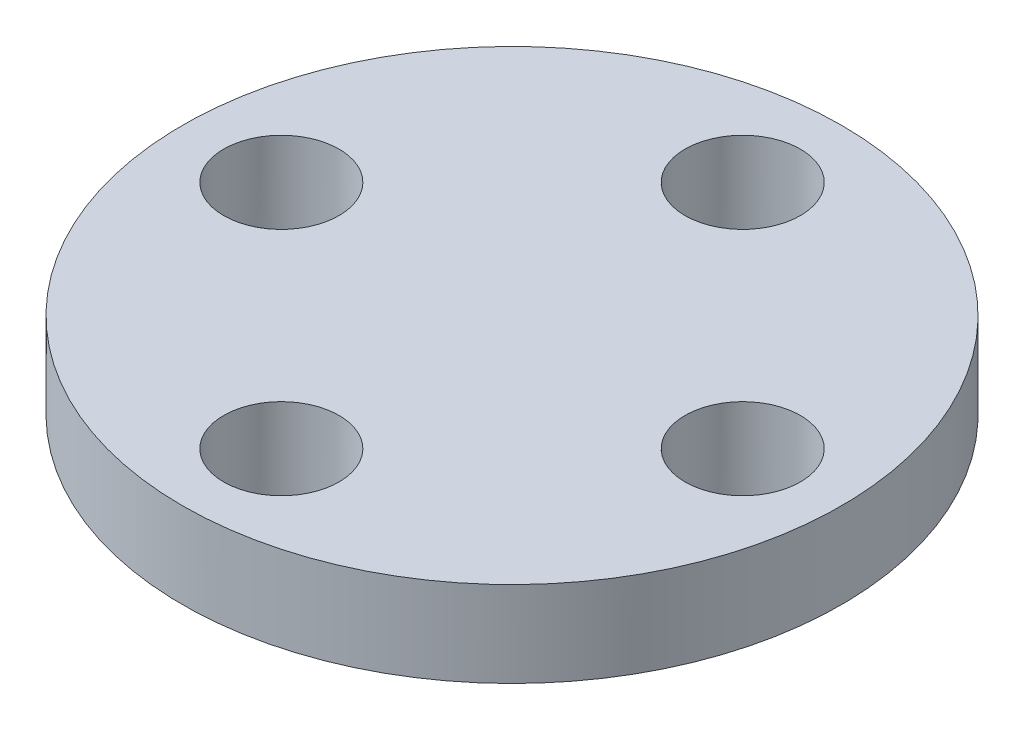
ISO-10303-21;
HEADER;
FILE_DESCRIPTION(('STEP AP214'),'2;1');
FILE_NAME('part.step','',(''),(''),'','','');
FILE_SCHEMA(('AUTOMOTIVE_DESIGN { 1 0 10303 214 1 1 1 1 }'));
ENDSEC;
DATA;
#1=APPLICATION_CONTEXT('core data for automotive mechanical design processes');
#2=APPLICATION_PROTOCOL_DEFINITION('international standard','automotive_design',2000,#1);
#3=PRODUCT_CONTEXT('',#1,'mechanical');
#4=PRODUCT('Part','Part','',(#3));
#5=PRODUCT_RELATED_PRODUCT_CATEGORY('part','',(#4));
#6=PRODUCT_DEFINITION_FORMATION('','',#4);
#7=PRODUCT_DEFINITION_CONTEXT('part definition',#1,'design');
#8=PRODUCT_DEFINITION('design','',#6,#7);
#9=PRODUCT_DEFINITION_SHAPE('','',#8);
#10=(LENGTH_UNIT() NAMED_UNIT(*) SI_UNIT(.MILLI.,.METRE.));
#11=(NAMED_UNIT(*) PLANE_ANGLE_UNIT() SI_UNIT($,.RADIAN.));
#12=(NAMED_UNIT(*) SI_UNIT($,.STERADIAN.) SOLID_ANGLE_UNIT());
#13=UNCERTAINTY_MEASURE_WITH_UNIT(LENGTH_MEASURE(1.E-05),#10,'distance_accuracy_value','');
#14=(GEOMETRIC_REPRESENTATION_CONTEXT(3) GLOBAL_UNCERTAINTY_ASSIGNED_CONTEXT((#13)) GLOBAL_UNIT_ASSIGNED_CONTEXT((#10,
#11,#12)) REPRESENTATION_CONTEXT('',''));
#15=CARTESIAN_POINT('',(0.,0.,0.));
#16=DIRECTION('',(0.,0.,1.));
#17=DIRECTION('',(1.,0.,0.));
#18=AXIS2_PLACEMENT_3D('',#15,#16,#17);
#19=CARTESIAN_POINT('',(0.,4.5,0.));
#20=DIRECTION('',(0.,-1.,0.));
#21=DIRECTION('',(0.,0.,-1.));
#22=AXIS2_PLACEMENT_3D('',#19,#20,#21);
#23=CYLINDRICAL_SURFACE('',#22,10.);
#24=CARTESIAN_POINT('',(0.,4.5,0.));
#25=DIRECTION('',(0.,1.,0.));
#26=DIRECTION('',(0.,0.,1.));
#27=AXIS2_PLACEMENT_3D('',#24,#25,#26);
#28=CIRCLE('',#27,10.);
#29=CARTESIAN_POINT('',(0.,4.5,10.));
#30=VERTEX_POINT('',#29);
#31=EDGE_CURVE('E11',#30,#30,#28,.T.);
#32=ORIENTED_EDGE('',*,*,#31,.F.);
#33=EDGE_LOOP('',(#32));
#34=FACE_BOUND('',#33,.T.);
#35=CARTESIAN_POINT('',(0.,1.9,0.));
#36=DIRECTION('',(0.,-1.,0.));
#37=DIRECTION('',(0.,0.,-1.));
#38=AXIS2_PLACEMENT_3D('',#35,#36,#37);
#39=CIRCLE('',#38,10.);
#40=CARTESIAN_POINT('',(0.,1.9,-10.));
#41=VERTEX_POINT('',#40);
#42=EDGE_CURVE('E48',#41,#41,#39,.T.);
#43=ORIENTED_EDGE('',*,*,#42,.F.);
#44=EDGE_LOOP('',(#43));
#45=FACE_BOUND('',#44,.T.);
#46=ADVANCED_FACE('F41',(#34,#45),#23,.T.);
#47=CARTESIAN_POINT('',(0.,4.5,0.));
#48=DIRECTION('',(0.,1.,0.));
#49=DIRECTION('',(0.,0.,1.));
#50=AXIS2_PLACEMENT_3D('',#47,#48,#49);
#51=PLANE('',#50);
#52=CARTESIAN_POINT('',(0.,4.5,-7.));
#53=DIRECTION('',(0.,1.,0.));
#54=DIRECTION('',(0.,0.,1.));
#55=AXIS2_PLACEMENT_3D('',#52,#53,#54);
#56=CIRCLE('',#55,1.75);
#57=CARTESIAN_POINT('',(0.,4.5,-5.25));
#58=VERTEX_POINT('',#57);
#59=EDGE_CURVE('E62',#58,#58,#56,.T.);
#60=ORIENTED_EDGE('',*,*,#59,.F.);
#61=EDGE_LOOP('',(#60));
#62=FACE_BOUND('',#61,.T.);
#63=CARTESIAN_POINT('',(7.,4.5,0.));
#64=DIRECTION('',(0.,1.,0.));
#65=DIRECTION('',(0.,0.,1.));
#66=AXIS2_PLACEMENT_3D('',#63,#64,#65);
#67=CIRCLE('',#66,1.75);
#68=CARTESIAN_POINT('',(7.,4.5,1.75));
#69=VERTEX_POINT('',#68);
#70=EDGE_CURVE('E150',#69,#69,#67,.T.);
#71=ORIENTED_EDGE('',*,*,#70,.F.);
#72=EDGE_LOOP('',(#71));
#73=FACE_BOUND('',#72,.T.);
#74=CARTESIAN_POINT('',(0.,4.5,7.));
#75=DIRECTION('',(0.,1.,0.));
#76=DIRECTION('',(0.,0.,1.));
#77=AXIS2_PLACEMENT_3D('',#74,#75,#76);
#78=CIRCLE('',#77,1.75);
#79=CARTESIAN_POINT('',(0.,4.5,8.75));
#80=VERTEX_POINT('',#79);
#81=EDGE_CURVE('E146',#80,#80,#78,.T.);
#82=ORIENTED_EDGE('',*,*,#81,.F.);
#83=EDGE_LOOP('',(#82));
#84=FACE_BOUND('',#83,.T.);
#85=CARTESIAN_POINT('',(-7.,4.5,0.));
#86=DIRECTION('',(0.,1.,0.));
#87=DIRECTION('',(0.,0.,1.));
#88=AXIS2_PLACEMENT_3D('',#85,#86,#87);
#89=CIRCLE('',#88,1.75);
#90=CARTESIAN_POINT('',(-7.,4.5,1.75));
#91=VERTEX_POINT('',#90);
#92=EDGE_CURVE('E79',#91,#91,#89,.T.);
#93=ORIENTED_EDGE('',*,*,#92,.F.);
#94=EDGE_LOOP('',(#93));
#95=FACE_BOUND('',#94,.T.);
#96=ORIENTED_EDGE('',*,*,#31,.T.);
#97=EDGE_LOOP('',(#96));
#98=FACE_BOUND('',#97,.T.);
#99=ADVANCED_FACE('F96',(#62,#73,#84,#95,#98),#51,.T.);
#100=CARTESIAN_POINT('',(0.,1.9,0.));
#101=DIRECTION('',(0.,-1.,0.));
#102=DIRECTION('',(0.,0.,-1.));
#103=AXIS2_PLACEMENT_3D('',#100,#101,#102);
#104=CYLINDRICAL_SURFACE('',#103,4.4);
#105=CARTESIAN_POINT('',(0.,1.9,0.));
#106=DIRECTION('',(0.,-1.,0.));
#107=DIRECTION('',(0.,0.,-1.));
#108=AXIS2_PLACEMENT_3D('',#105,#106,#107);
#109=CIRCLE('',#108,4.4);
#110=CARTESIAN_POINT('',(0.,1.9,-4.4));
#111=VERTEX_POINT('',#110);
#112=EDGE_CURVE('E53',#111,#111,#109,.T.);
#113=CARTESIAN_POINT('',(0.,0.,0.));
#114=DIRECTION('',(0.,-1.,0.));
#115=DIRECTION('',(0.,0.,-1.));
#116=AXIS2_PLACEMENT_3D('',#113,#114,#115);
#117=CIRCLE('',#116,4.4);
#118=CARTESIAN_POINT('',(0.,0.,-4.4));
#119=VERTEX_POINT('',#118);
#120=EDGE_CURVE('E57',#119,#119,#117,.T.);
#121=CARTESIAN_POINT('',(0.,1.9,-4.4));
#122=CARTESIAN_POINT('',(0.,1.88020833333333,-4.4));
#123=CARTESIAN_POINT('',(0.,1.86041666666667,-4.4));
#124=CARTESIAN_POINT('',(0.,1.82083333333333,-4.4));
#125=CARTESIAN_POINT('',(0.,1.80104166666667,-4.4));
#126=CARTESIAN_POINT('',(0.,1.76145833333333,-4.4));
#127=CARTESIAN_POINT('',(0.,1.74166666666667,-4.4));
#128=CARTESIAN_POINT('',(0.,1.70208333333333,-4.4));
#129=CARTESIAN_POINT('',(0.,1.68229166666667,-4.4));
#130=CARTESIAN_POINT('',(0.,1.64270833333333,-4.4));
#131=CARTESIAN_POINT('',(0.,1.62291666666667,-4.4));
#132=CARTESIAN_POINT('',(0.,1.58333333333333,-4.4));
#133=CARTESIAN_POINT('',(0.,1.56354166666667,-4.4));
#134=CARTESIAN_POINT('',(0.,1.52395833333333,-4.4));
#135=CARTESIAN_POINT('',(0.,1.50416666666667,-4.4));
#136=CARTESIAN_POINT('',(0.,1.46458333333333,-4.4));
#137=CARTESIAN_POINT('',(0.,1.44479166666667,-4.4));
#138=CARTESIAN_POINT('',(0.,1.40520833333333,-4.4));
#139=CARTESIAN_POINT('',(0.,1.38541666666667,-4.4));
#140=CARTESIAN_POINT('',(0.,1.34583333333333,-4.4));
#141=CARTESIAN_POINT('',(0.,1.32604166666667,-4.4));
#142=CARTESIAN_POINT('',(0.,1.28645833333333,-4.4));
#143=CARTESIAN_POINT('',(0.,1.26666666666667,-4.4));
#144=CARTESIAN_POINT('',(0.,1.22708333333333,-4.4));
#145=CARTESIAN_POINT('',(0.,1.20729166666667,-4.4));
#146=CARTESIAN_POINT('',(0.,1.16770833333333,-4.4));
#147=CARTESIAN_POINT('',(0.,1.14791666666667,-4.4));
#148=CARTESIAN_POINT('',(0.,1.10833333333333,-4.4));
#149=CARTESIAN_POINT('',(0.,1.08854166666667,-4.4));
#150=CARTESIAN_POINT('',(0.,1.04895833333333,-4.4));
#151=CARTESIAN_POINT('',(0.,1.02916666666667,-4.4));
#152=CARTESIAN_POINT('',(0.,0.989583333333333,-4.4));
#153=CARTESIAN_POINT('',(0.,0.969791666666667,-4.4));
#154=CARTESIAN_POINT('',(0.,0.930208333333333,-4.4));
#155=CARTESIAN_POINT('',(0.,0.910416666666667,-4.4));
#156=CARTESIAN_POINT('',(0.,0.870833333333333,-4.4));
#157=CARTESIAN_POINT('',(0.,0.851041666666667,-4.4));
#158=CARTESIAN_POINT('',(0.,0.811458333333333,-4.4));
#159=CARTESIAN_POINT('',(0.,0.791666666666667,-4.4));
#160=CARTESIAN_POINT('',(0.,0.752083333333333,-4.4));
#161=CARTESIAN_POINT('',(0.,0.732291666666667,-4.4));
#162=CARTESIAN_POINT('',(0.,0.692708333333333,-4.4));
#163=CARTESIAN_POINT('',(0.,0.672916666666667,-4.4));
#164=CARTESIAN_POINT('',(0.,0.633333333333333,-4.4));
#165=CARTESIAN_POINT('',(0.,0.613541666666667,-4.4));
#166=CARTESIAN_POINT('',(0.,0.573958333333333,-4.4));
#167=CARTESIAN_POINT('',(0.,0.554166666666667,-4.4));
#168=CARTESIAN_POINT('',(0.,0.514583333333334,-4.4));
#169=CARTESIAN_POINT('',(0.,0.494791666666667,-4.4));
#170=CARTESIAN_POINT('',(0.,0.455208333333333,-4.4));
#171=CARTESIAN_POINT('',(0.,0.435416666666667,-4.4));
#172=CARTESIAN_POINT('',(0.,0.395833333333333,-4.4));
#173=CARTESIAN_POINT('',(0.,0.376041666666667,-4.4));
#174=CARTESIAN_POINT('',(0.,0.336458333333333,-4.4));
#175=CARTESIAN_POINT('',(0.,0.316666666666667,-4.4));
#176=CARTESIAN_POINT('',(0.,0.277083333333333,-4.4));
#177=CARTESIAN_POINT('',(0.,0.257291666666667,-4.4));
#178=CARTESIAN_POINT('',(0.,0.217708333333333,-4.4));
#179=CARTESIAN_POINT('',(0.,0.197916666666667,-4.4));
#180=CARTESIAN_POINT('',(0.,0.158333333333333,-4.4));
#181=CARTESIAN_POINT('',(0.,0.138541666666667,-4.4));
#182=CARTESIAN_POINT('',(0.,0.0989583333333333,-4.4));
#183=CARTESIAN_POINT('',(0.,0.0791666666666666,-4.4));
#184=CARTESIAN_POINT('',(0.,0.0395833333333333,-4.4));
#185=CARTESIAN_POINT('',(0.,0.0197916666666666,-4.4));
#186=CARTESIAN_POINT('',(0.,0.,-4.4));
#187=B_SPLINE_CURVE_WITH_KNOTS('',3,(#121,#122,#123,#124,#125,#126,#127,#128,#129,#130,#131,
#132,#133,#134,#135,#136,#137,#138,#139,#140,#141,#142,#143,#144,#145,#146,#147,#148,#149,#150,
#151,#152,#153,#154,#155,#156,#157,#158,#159,#160,#161,#162,#163,#164,#165,#166,#167,#168,#169,
#170,#171,#172,#173,#174,#175,#176,#177,#178,#179,#180,#181,#182,#183,#184,#185,#186),
.UNSPECIFIED.,.F.,.F.,(4,2,2,2,2,2,2,2,2,2,2,2,2,2,2,2,2,2,2,2,2,2,2,2,2,2,2,2,2,2,2,2,4),(0.,
0.059375,0.11875,0.178125,0.2375,0.296875,0.35625,0.415625,0.475,0.534375,0.59375,0.653125,
0.7125,0.771875,0.83125,0.890625,0.95,1.009375,1.06875,1.128125,1.1875,1.246875,1.30625,
1.365625,1.425,1.484375,1.54375,1.603125,1.6625,1.721875,1.78125,1.840625,1.9),.UNSPECIFIED.);
#188=EDGE_CURVE('BSEAM84',#111,#119,#187,.T.);
#189=ORIENTED_EDGE('',*,*,#112,.T.);
#190=ORIENTED_EDGE('',*,*,#120,.F.);
#191=ORIENTED_EDGE('',*,*,#188,.T.);
#192=ORIENTED_EDGE('',*,*,#188,.F.);
#193=EDGE_LOOP('',(#189,#191,#190,#192));
#194=FACE_BOUND('',#193,.T.);
#195=ADVANCED_FACE('F84',(#194),#104,.T.);
#196=CARTESIAN_POINT('',(0.,1.9,0.));
#197=DIRECTION('',(0.,-1.,0.));
#198=DIRECTION('',(0.,0.,-1.));
#199=AXIS2_PLACEMENT_3D('',#196,#197,#198);
#200=PLANE('',#199);
#201=CARTESIAN_POINT('',(0.,1.9,-7.));
#202=DIRECTION('',(0.,-1.,0.));
#203=DIRECTION('',(0.,0.,-1.));
#204=AXIS2_PLACEMENT_3D('',#201,#202,#203);
#205=CIRCLE('',#204,1.75);
#206=CARTESIAN_POINT('',(0.,1.9,-8.75));
#207=VERTEX_POINT('',#206);
#208=EDGE_CURVE('E44',#207,#207,#205,.T.);
#209=ORIENTED_EDGE('',*,*,#208,.F.);
#210=EDGE_LOOP('',(#209));
#211=FACE_BOUND('',#210,.T.);
#212=CARTESIAN_POINT('',(7.,1.9,0.));
#213=DIRECTION('',(0.,-1.,0.));
#214=DIRECTION('',(0.,0.,-1.));
#215=AXIS2_PLACEMENT_3D('',#212,#213,#214);
#216=CIRCLE('',#215,1.75);
#217=CARTESIAN_POINT('',(7.,1.9,-1.75));
#218=VERTEX_POINT('',#217);
#219=EDGE_CURVE('E64',#218,#218,#216,.T.);
#220=ORIENTED_EDGE('',*,*,#219,.F.);
#221=EDGE_LOOP('',(#220));
#222=FACE_BOUND('',#221,.T.);
#223=CARTESIAN_POINT('',(0.,1.9,7.));
#224=DIRECTION('',(0.,-1.,0.));
#225=DIRECTION('',(0.,0.,-1.));
#226=AXIS2_PLACEMENT_3D('',#223,#224,#225);
#227=CIRCLE('',#226,1.75);
#228=CARTESIAN_POINT('',(0.,1.9,5.25));
#229=VERTEX_POINT('',#228);
#230=EDGE_CURVE('E61',#229,#229,#227,.T.);
#231=ORIENTED_EDGE('',*,*,#230,.F.);
#232=EDGE_LOOP('',(#231));
#233=FACE_BOUND('',#232,.T.);
#234=CARTESIAN_POINT('',(-7.,1.9,0.));
#235=DIRECTION('',(0.,-1.,0.));
#236=DIRECTION('',(0.,0.,-1.));
#237=AXIS2_PLACEMENT_3D('',#234,#235,#236);
#238=CIRCLE('',#237,1.75);
#239=CARTESIAN_POINT('',(-7.,1.9,-1.75));
#240=VERTEX_POINT('',#239);
#241=EDGE_CURVE('E58',#240,#240,#238,.T.);
#242=ORIENTED_EDGE('',*,*,#241,.F.);
#243=EDGE_LOOP('',(#242));
#244=FACE_BOUND('',#243,.T.);
#245=ORIENTED_EDGE('',*,*,#112,.F.);
#246=EDGE_LOOP('',(#245));
#247=FACE_BOUND('',#246,.T.);
#248=ORIENTED_EDGE('',*,*,#42,.T.);
#249=EDGE_LOOP('',(#248));
#250=FACE_BOUND('',#249,.T.);
#251=ADVANCED_FACE('F87',(#211,#222,#233,#244,#247,#250),#200,.T.);
#252=CARTESIAN_POINT('',(0.,0.,0.));
#253=DIRECTION('',(0.,1.,0.));
#254=DIRECTION('',(0.,0.,1.));
#255=AXIS2_PLACEMENT_3D('',#252,#253,#254);
#256=PLANE('',#255);
#257=CARTESIAN_POINT('',(0.,0.,0.));
#258=DIRECTION('',(0.,-1.,0.));
#259=DIRECTION('',(0.,0.,-1.));
#260=AXIS2_PLACEMENT_3D('',#257,#258,#259);
#261=CIRCLE('',#260,2.75);
#262=CARTESIAN_POINT('',(0.,0.,-2.75));
#263=VERTEX_POINT('',#262);
#264=EDGE_CURVE('E69',#263,#263,#261,.T.);
#265=ORIENTED_EDGE('',*,*,#264,.F.);
#266=EDGE_LOOP('',(#265));
#267=FACE_BOUND('',#266,.T.);
#268=ORIENTED_EDGE('',*,*,#120,.T.);
#269=EDGE_LOOP('',(#268));
#270=FACE_BOUND('',#269,.T.);
#271=ADVANCED_FACE('F90',(#267,#270),#256,.F.);
#272=CARTESIAN_POINT('',(0.,1.9,0.));
#273=DIRECTION('',(0.,-1.,0.));
#274=DIRECTION('',(0.,0.,-1.));
#275=AXIS2_PLACEMENT_3D('',#272,#273,#274);
#276=CYLINDRICAL_SURFACE('',#275,2.75);
#277=CARTESIAN_POINT('',(0.,2.9,0.));
#278=DIRECTION('',(0.,-1.,0.));
#279=DIRECTION('',(0.,0.,-1.));
#280=AXIS2_PLACEMENT_3D('',#277,#278,#279);
#281=CIRCLE('',#280,2.75);
#282=CARTESIAN_POINT('',(0.,2.9,-2.75));
#283=VERTEX_POINT('',#282);
#284=EDGE_CURVE('E143',#283,#283,#281,.T.);
#285=CARTESIAN_POINT('',(0.,0.,-2.75));
#286=CARTESIAN_POINT('',(0.,0.0302083333333333,-2.75));
#287=CARTESIAN_POINT('',(0.,0.0604166666666667,-2.75));
#288=CARTESIAN_POINT('',(0.,0.120833333333333,-2.75));
#289=CARTESIAN_POINT('',(0.,0.151041666666667,-2.75));
#290=CARTESIAN_POINT('',(0.,0.211458333333333,-2.75));
#291=CARTESIAN_POINT('',(0.,0.241666666666667,-2.75));
#292=CARTESIAN_POINT('',(0.,0.302083333333333,-2.75));
#293=CARTESIAN_POINT('',(0.,0.332291666666667,-2.75));
#294=CARTESIAN_POINT('',(0.,0.392708333333333,-2.75));
#295=CARTESIAN_POINT('',(0.,0.422916666666667,-2.75));
#296=CARTESIAN_POINT('',(0.,0.483333333333333,-2.75));
#297=CARTESIAN_POINT('',(0.,0.513541666666667,-2.75));
#298=CARTESIAN_POINT('',(0.,0.573958333333334,-2.75));
#299=CARTESIAN_POINT('',(0.,0.604166666666667,-2.75));
#300=CARTESIAN_POINT('',(0.,0.664583333333334,-2.75));
#301=CARTESIAN_POINT('',(0.,0.694791666666667,-2.75));
#302=CARTESIAN_POINT('',(0.,0.755208333333333,-2.75));
#303=CARTESIAN_POINT('',(0.,0.785416666666667,-2.75));
#304=CARTESIAN_POINT('',(0.,0.845833333333334,-2.75));
#305=CARTESIAN_POINT('',(0.,0.876041666666667,-2.75));
#306=CARTESIAN_POINT('',(0.,0.936458333333333,-2.75));
#307=CARTESIAN_POINT('',(0.,0.966666666666667,-2.75));
#308=CARTESIAN_POINT('',(0.,1.02708333333333,-2.75));
#309=CARTESIAN_POINT('',(0.,1.05729166666667,-2.75));
#310=CARTESIAN_POINT('',(0.,1.11770833333333,-2.75));
#311=CARTESIAN_POINT('',(0.,1.14791666666667,-2.75));
#312=CARTESIAN_POINT('',(0.,1.20833333333333,-2.75));
#313=CARTESIAN_POINT('',(0.,1.23854166666667,-2.75));
#314=CARTESIAN_POINT('',(0.,1.29895833333333,-2.75));
#315=CARTESIAN_POINT('',(0.,1.32916666666667,-2.75));
#316=CARTESIAN_POINT('',(0.,1.38958333333333,-2.75));
#317=CARTESIAN_POINT('',(0.,1.41979166666667,-2.75));
#318=CARTESIAN_POINT('',(0.,1.48020833333333,-2.75));
#319=CARTESIAN_POINT('',(0.,1.51041666666667,-2.75));
#320=CARTESIAN_POINT('',(0.,1.57083333333333,-2.75));
#321=CARTESIAN_POINT('',(0.,1.60104166666667,-2.75));
#322=CARTESIAN_POINT('',(0.,1.66145833333333,-2.75));
#323=CARTESIAN_POINT('',(0.,1.69166666666667,-2.75));
#324=CARTESIAN_POINT('',(0.,1.75208333333333,-2.75));
#325=CARTESIAN_POINT('',(0.,1.78229166666667,-2.75));
#326=CARTESIAN_POINT('',(0.,1.84270833333333,-2.75));
#327=CARTESIAN_POINT('',(0.,1.87291666666667,-2.75));
#328=CARTESIAN_POINT('',(0.,1.93333333333333,-2.75));
#329=CARTESIAN_POINT('',(0.,1.96354166666667,-2.75));
#330=CARTESIAN_POINT('',(0.,2.02395833333333,-2.75));
#331=CARTESIAN_POINT('',(0.,2.05416666666667,-2.75));
#332=CARTESIAN_POINT('',(0.,2.11458333333333,-2.75));
#333=CARTESIAN_POINT('',(0.,2.14479166666667,-2.75));
#334=CARTESIAN_POINT('',(0.,2.20520833333333,-2.75));
#335=CARTESIAN_POINT('',(0.,2.23541666666667,-2.75));
#336=CARTESIAN_POINT('',(0.,2.29583333333333,-2.75));
#337=CARTESIAN_POINT('',(0.,2.32604166666667,-2.75));
#338=CARTESIAN_POINT('',(0.,2.38645833333333,-2.75));
#339=CARTESIAN_POINT('',(0.,2.41666666666667,-2.75));
#340=CARTESIAN_POINT('',(0.,2.47708333333333,-2.75));
#341=CARTESIAN_POINT('',(0.,2.50729166666667,-2.75));
#342=CARTESIAN_POINT('',(0.,2.56770833333333,-2.75));
#343=CARTESIAN_POINT('',(0.,2.59791666666667,-2.75));
#344=CARTESIAN_POINT('',(0.,2.65833333333333,-2.75));
#345=CARTESIAN_POINT('',(0.,2.68854166666667,-2.75));
#346=CARTESIAN_POINT('',(0.,2.74895833333333,-2.75));
#347=CARTESIAN_POINT('',(0.,2.77916666666667,-2.75));
#348=CARTESIAN_POINT('',(0.,2.83958333333333,-2.75));
#349=CARTESIAN_POINT('',(0.,2.86979166666667,-2.75));
#350=CARTESIAN_POINT('',(0.,2.9,-2.75));
#351=B_SPLINE_CURVE_WITH_KNOTS('',3,(#285,#286,#287,#288,#289,#290,#291,#292,#293,#294,#295,
#296,#297,#298,#299,#300,#301,#302,#303,#304,#305,#306,#307,#308,#309,#310,#311,#312,#313,#314,
#315,#316,#317,#318,#319,#320,#321,#322,#323,#324,#325,#326,#327,#328,#329,#330,#331,#332,#333,
#334,#335,#336,#337,#338,#339,#340,#341,#342,#343,#344,#345,#346,#347,#348,#349,#350),
.UNSPECIFIED.,.F.,.F.,(4,2,2,2,2,2,2,2,2,2,2,2,2,2,2,2,2,2,2,2,2,2,2,2,2,2,2,2,2,2,2,2,4),(0.,
0.090625,0.18125,0.271875,0.3625,0.453125,0.54375,0.634375,0.725,0.815625,0.90625,0.996875,
1.0875,1.178125,1.26875,1.359375,1.45,1.540625,1.63125,1.721875,1.8125,1.903125,1.99375,
2.084375,2.175,2.265625,2.35625,2.446875,2.5375,2.628125,2.71875,2.809375,2.9),.UNSPECIFIED.);
#352=EDGE_CURVE('BSEAM110',#263,#283,#351,.T.);
#353=ORIENTED_EDGE('',*,*,#264,.T.);
#354=ORIENTED_EDGE('',*,*,#284,.F.);
#355=ORIENTED_EDGE('',*,*,#352,.T.);
#356=ORIENTED_EDGE('',*,*,#352,.F.);
#357=EDGE_LOOP('',(#353,#355,#354,#356));
#358=FACE_BOUND('',#357,.T.);
#359=ADVANCED_FACE('F110',(#358),#276,.F.);
#360=CARTESIAN_POINT('',(-7.,0.,0.));
#361=DIRECTION('',(0.,1.,0.));
#362=DIRECTION('',(0.,0.,1.));
#363=AXIS2_PLACEMENT_3D('',#360,#361,#362);
#364=CYLINDRICAL_SURFACE('',#363,1.75);
#365=ORIENTED_EDGE('',*,*,#241,.T.);
#366=EDGE_LOOP('',(#365));
#367=FACE_BOUND('',#366,.T.);
#368=ORIENTED_EDGE('',*,*,#92,.T.);
#369=EDGE_LOOP('',(#368));
#370=FACE_BOUND('',#369,.T.);
#371=ADVANCED_FACE('F115',(#367,#370),#364,.F.);
#372=CARTESIAN_POINT('',(0.,0.,7.));
#373=DIRECTION('',(0.,1.,0.));
#374=DIRECTION('',(0.,0.,1.));
#375=AXIS2_PLACEMENT_3D('',#372,#373,#374);
#376=CYLINDRICAL_SURFACE('',#375,1.75);
#377=ORIENTED_EDGE('',*,*,#230,.T.);
#378=EDGE_LOOP('',(#377));
#379=FACE_BOUND('',#378,.T.);
#380=ORIENTED_EDGE('',*,*,#81,.T.);
#381=EDGE_LOOP('',(#380));
#382=FACE_BOUND('',#381,.T.);
#383=ADVANCED_FACE('F122',(#379,#382),#376,.F.);
#384=CARTESIAN_POINT('',(7.,0.,0.));
#385=DIRECTION('',(0.,1.,0.));
#386=DIRECTION('',(0.,0.,1.));
#387=AXIS2_PLACEMENT_3D('',#384,#385,#386);
#388=CYLINDRICAL_SURFACE('',#387,1.75);
#389=ORIENTED_EDGE('',*,*,#219,.T.);
#390=EDGE_LOOP('',(#389));
#391=FACE_BOUND('',#390,.T.);
#392=ORIENTED_EDGE('',*,*,#70,.T.);
#393=EDGE_LOOP('',(#392));
#394=FACE_BOUND('',#393,.T.);
#395=ADVANCED_FACE('F129',(#391,#394),#388,.F.);
#396=CARTESIAN_POINT('',(0.,0.,-7.));
#397=DIRECTION('',(0.,1.,0.));
#398=DIRECTION('',(0.,0.,1.));
#399=AXIS2_PLACEMENT_3D('',#396,#397,#398);
#400=CYLINDRICAL_SURFACE('',#399,1.75);
#401=ORIENTED_EDGE('',*,*,#208,.T.);
#402=EDGE_LOOP('',(#401));
#403=FACE_BOUND('',#402,.T.);
#404=ORIENTED_EDGE('',*,*,#59,.T.);
#405=EDGE_LOOP('',(#404));
#406=FACE_BOUND('',#405,.T.);
#407=ADVANCED_FACE('F133',(#403,#406),#400,.F.);
#408=CARTESIAN_POINT('',(0.,2.9,0.));
#409=DIRECTION('',(0.,-1.,0.));
#410=DIRECTION('',(0.,0.,-1.));
#411=AXIS2_PLACEMENT_3D('',#408,#409,#410);
#412=PLANE('',#411);
#413=ORIENTED_EDGE('',*,*,#284,.T.);
#414=EDGE_LOOP('',(#413));
#415=FACE_BOUND('',#414,.T.);
#416=ADVANCED_FACE('F136',(#415),#412,.T.);
#417=CLOSED_SHELL('',(#46,#99,#195,#251,#271,#359,#371,#383,#395,#407,#416));
#418=MANIFOLD_SOLID_BREP('B2',#417);
#419=ADVANCED_BREP_SHAPE_REPRESENTATION('',(#18,#418),#14);
#420=SHAPE_DEFINITION_REPRESENTATION(#9,#419);
ENDSEC;
END-ISO-10303-21;
